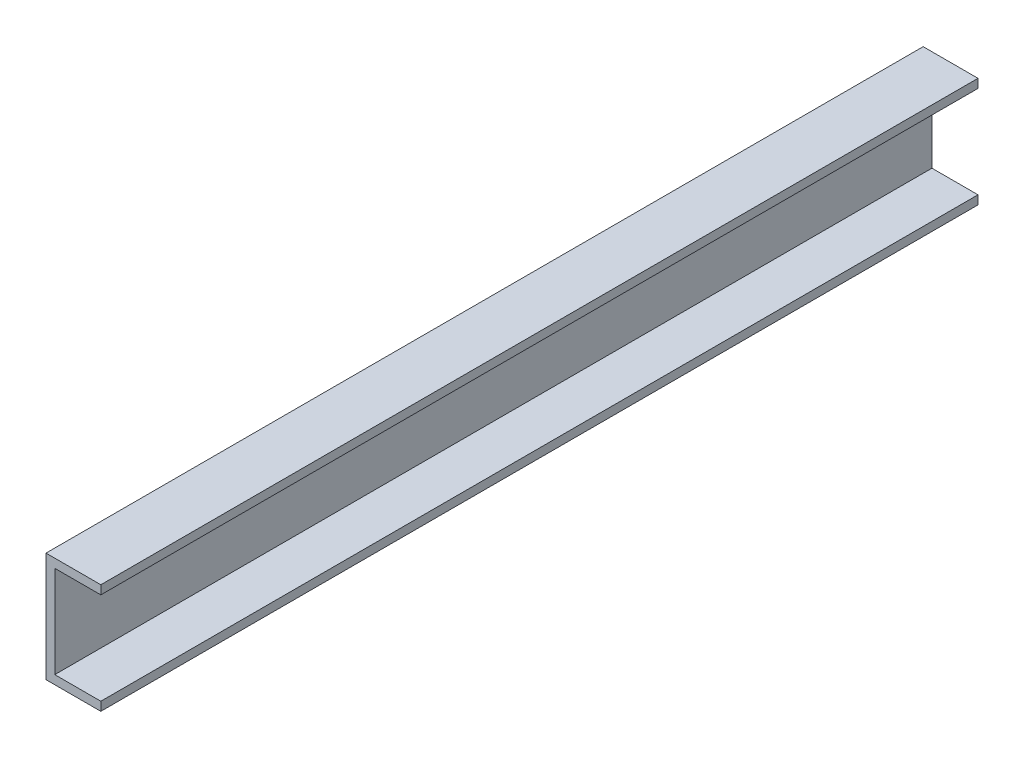
ISO-10303-21;
HEADER;
FILE_DESCRIPTION(('STEP AP214'),'2;1');
FILE_NAME('part.step','',(''),(''),'','','');
FILE_SCHEMA(('AUTOMOTIVE_DESIGN { 1 0 10303 214 1 1 1 1 }'));
ENDSEC;
DATA;
#1=APPLICATION_CONTEXT('core data for automotive mechanical design processes');
#2=APPLICATION_PROTOCOL_DEFINITION('international standard','automotive_design',2000,#1);
#3=PRODUCT_CONTEXT('',#1,'mechanical');
#4=PRODUCT('Part','Part','',(#3));
#5=PRODUCT_RELATED_PRODUCT_CATEGORY('part','',(#4));
#6=PRODUCT_DEFINITION_FORMATION('','',#4);
#7=PRODUCT_DEFINITION_CONTEXT('part definition',#1,'design');
#8=PRODUCT_DEFINITION('design','',#6,#7);
#9=PRODUCT_DEFINITION_SHAPE('','',#8);
#10=(LENGTH_UNIT() NAMED_UNIT(*) SI_UNIT(.MILLI.,.METRE.));
#11=(NAMED_UNIT(*) PLANE_ANGLE_UNIT() SI_UNIT($,.RADIAN.));
#12=(NAMED_UNIT(*) SI_UNIT($,.STERADIAN.) SOLID_ANGLE_UNIT());
#13=UNCERTAINTY_MEASURE_WITH_UNIT(LENGTH_MEASURE(1.E-05),#10,'distance_accuracy_value','');
#14=(GEOMETRIC_REPRESENTATION_CONTEXT(3) GLOBAL_UNCERTAINTY_ASSIGNED_CONTEXT((#13)) GLOBAL_UNIT_ASSIGNED_CONTEXT((#10,
#11,#12)) REPRESENTATION_CONTEXT('',''));
#15=CARTESIAN_POINT('',(0.,0.,0.));
#16=DIRECTION('',(0.,0.,1.));
#17=DIRECTION('',(1.,0.,0.));
#18=AXIS2_PLACEMENT_3D('',#15,#16,#17);
#19=CARTESIAN_POINT('',(50.,0.,800.));
#20=DIRECTION('',(0.,1.,0.));
#21=DIRECTION('',(-1.,0.,0.));
#22=AXIS2_PLACEMENT_3D('',#19,#20,#21);
#23=PLANE('',#22);
#24=DIRECTION('',(1.,0.,0.));
#25=VECTOR('',#24,1.);
#26=CARTESIAN_POINT('',(50.,0.,0.));
#27=LINE('',#26,#25);
#28=CARTESIAN_POINT('',(0.,0.,0.));
#29=VERTEX_POINT('',#28);
#30=CARTESIAN_POINT('',(50.,0.,0.));
#31=VERTEX_POINT('',#30);
#32=EDGE_CURVE('E135',#29,#31,#27,.T.);
#33=ORIENTED_EDGE('',*,*,#32,.T.);
#34=DIRECTION('',(0.,0.,-1.));
#35=VECTOR('',#34,1.);
#36=CARTESIAN_POINT('',(50.,0.,800.));
#37=LINE('',#36,#35);
#38=CARTESIAN_POINT('',(50.,0.,800.));
#39=VERTEX_POINT('',#38);
#40=EDGE_CURVE('E11',#39,#31,#37,.T.);
#41=ORIENTED_EDGE('',*,*,#40,.F.);
#42=DIRECTION('',(1.,0.,0.));
#43=VECTOR('',#42,1.);
#44=CARTESIAN_POINT('',(50.,0.,800.));
#45=LINE('',#44,#43);
#46=CARTESIAN_POINT('',(0.,0.,800.));
#47=VERTEX_POINT('',#46);
#48=EDGE_CURVE('E149',#47,#39,#45,.T.);
#49=ORIENTED_EDGE('',*,*,#48,.F.);
#50=DIRECTION('',(0.,0.,-1.));
#51=VECTOR('',#50,1.);
#52=CARTESIAN_POINT('',(0.,0.,800.));
#53=LINE('',#52,#51);
#54=EDGE_CURVE('E131',#47,#29,#53,.T.);
#55=ORIENTED_EDGE('',*,*,#54,.T.);
#56=EDGE_LOOP('',(#33,#41,#49,#55));
#57=FACE_BOUND('',#56,.T.);
#58=ADVANCED_FACE('F39',(#57),#23,.F.);
#59=CARTESIAN_POINT('',(50.,8.00000000000001,800.));
#60=DIRECTION('',(-1.,0.,0.));
#61=DIRECTION('',(0.,0.,1.));
#62=AXIS2_PLACEMENT_3D('',#59,#60,#61);
#63=PLANE('',#62);
#64=DIRECTION('',(0.,1.,0.));
#65=VECTOR('',#64,1.);
#66=CARTESIAN_POINT('',(50.,8.00000000000001,0.));
#67=LINE('',#66,#65);
#68=CARTESIAN_POINT('',(50.,8.00000000000001,0.));
#69=VERTEX_POINT('',#68);
#70=EDGE_CURVE('E138',#31,#69,#67,.T.);
#71=ORIENTED_EDGE('',*,*,#70,.T.);
#72=DIRECTION('',(0.,0.,-1.));
#73=VECTOR('',#72,1.);
#74=CARTESIAN_POINT('',(50.,8.00000000000001,800.));
#75=LINE('',#74,#73);
#76=CARTESIAN_POINT('',(50.,8.00000000000001,800.));
#77=VERTEX_POINT('',#76);
#78=EDGE_CURVE('E47',#77,#69,#75,.T.);
#79=ORIENTED_EDGE('',*,*,#78,.F.);
#80=DIRECTION('',(0.,1.,0.));
#81=VECTOR('',#80,1.);
#82=CARTESIAN_POINT('',(50.,8.00000000000001,800.));
#83=LINE('',#82,#81);
#84=EDGE_CURVE('E98',#39,#77,#83,.T.);
#85=ORIENTED_EDGE('',*,*,#84,.F.);
#86=ORIENTED_EDGE('',*,*,#40,.T.);
#87=EDGE_LOOP('',(#71,#79,#85,#86));
#88=FACE_BOUND('',#87,.T.);
#89=ADVANCED_FACE('F184',(#88),#63,.F.);
#90=CARTESIAN_POINT('',(8.00000000000001,8.00000000000001,800.));
#91=DIRECTION('',(0.,-1.,0.));
#92=DIRECTION('',(0.,0.,-1.));
#93=AXIS2_PLACEMENT_3D('',#90,#91,#92);
#94=PLANE('',#93);
#95=DIRECTION('',(-1.,0.,0.));
#96=VECTOR('',#95,1.);
#97=CARTESIAN_POINT('',(8.00000000000001,8.00000000000001,0.));
#98=LINE('',#97,#96);
#99=CARTESIAN_POINT('',(8.00000000000001,8.00000000000001,0.));
#100=VERTEX_POINT('',#99);
#101=EDGE_CURVE('E140',#69,#100,#98,.T.);
#102=ORIENTED_EDGE('',*,*,#101,.T.);
#103=DIRECTION('',(0.,0.,-1.));
#104=VECTOR('',#103,1.);
#105=CARTESIAN_POINT('',(8.00000000000001,8.00000000000001,800.));
#106=LINE('',#105,#104);
#107=CARTESIAN_POINT('',(8.00000000000001,8.00000000000001,800.));
#108=VERTEX_POINT('',#107);
#109=EDGE_CURVE('E156',#108,#100,#106,.T.);
#110=ORIENTED_EDGE('',*,*,#109,.F.);
#111=DIRECTION('',(-1.,0.,0.));
#112=VECTOR('',#111,1.);
#113=CARTESIAN_POINT('',(8.00000000000001,8.00000000000001,800.));
#114=LINE('',#113,#112);
#115=EDGE_CURVE('E164',#77,#108,#114,.T.);
#116=ORIENTED_EDGE('',*,*,#115,.F.);
#117=ORIENTED_EDGE('',*,*,#78,.T.);
#118=EDGE_LOOP('',(#102,#110,#116,#117));
#119=FACE_BOUND('',#118,.T.);
#120=ADVANCED_FACE('F162',(#119),#94,.F.);
#121=CARTESIAN_POINT('',(8.,92.,800.));
#122=DIRECTION('',(-1.,0.,0.));
#123=DIRECTION('',(0.,-1.,0.));
#124=AXIS2_PLACEMENT_3D('',#121,#122,#123);
#125=PLANE('',#124);
#126=DIRECTION('',(0.,1.,0.));
#127=VECTOR('',#126,1.);
#128=CARTESIAN_POINT('',(8.,92.,0.));
#129=LINE('',#128,#127);
#130=CARTESIAN_POINT('',(8.,92.,0.));
#131=VERTEX_POINT('',#130);
#132=EDGE_CURVE('E142',#100,#131,#129,.T.);
#133=ORIENTED_EDGE('',*,*,#132,.T.);
#134=DIRECTION('',(0.,0.,-1.));
#135=VECTOR('',#134,1.);
#136=CARTESIAN_POINT('',(8.,92.,800.));
#137=LINE('',#136,#135);
#138=CARTESIAN_POINT('',(8.,92.,800.));
#139=VERTEX_POINT('',#138);
#140=EDGE_CURVE('E153',#139,#131,#137,.T.);
#141=ORIENTED_EDGE('',*,*,#140,.F.);
#142=DIRECTION('',(0.,1.,0.));
#143=VECTOR('',#142,1.);
#144=CARTESIAN_POINT('',(8.,92.,800.));
#145=LINE('',#144,#143);
#146=EDGE_CURVE('E176',#108,#139,#145,.T.);
#147=ORIENTED_EDGE('',*,*,#146,.F.);
#148=ORIENTED_EDGE('',*,*,#109,.T.);
#149=EDGE_LOOP('',(#133,#141,#147,#148));
#150=FACE_BOUND('',#149,.T.);
#151=ADVANCED_FACE('F172',(#150),#125,.F.);
#152=CARTESIAN_POINT('',(50.,92.,800.));
#153=DIRECTION('',(0.,1.,0.));
#154=DIRECTION('',(0.,0.,1.));
#155=AXIS2_PLACEMENT_3D('',#152,#153,#154);
#156=PLANE('',#155);
#157=DIRECTION('',(1.,0.,0.));
#158=VECTOR('',#157,1.);
#159=CARTESIAN_POINT('',(50.,92.,0.));
#160=LINE('',#159,#158);
#161=CARTESIAN_POINT('',(50.,92.,0.));
#162=VERTEX_POINT('',#161);
#163=EDGE_CURVE('E144',#131,#162,#160,.T.);
#164=ORIENTED_EDGE('',*,*,#163,.T.);
#165=DIRECTION('',(0.,0.,-1.));
#166=VECTOR('',#165,1.);
#167=CARTESIAN_POINT('',(50.,92.,800.));
#168=LINE('',#167,#166);
#169=CARTESIAN_POINT('',(50.,92.,800.));
#170=VERTEX_POINT('',#169);
#171=EDGE_CURVE('E126',#170,#162,#168,.T.);
#172=ORIENTED_EDGE('',*,*,#171,.F.);
#173=DIRECTION('',(1.,0.,0.));
#174=VECTOR('',#173,1.);
#175=CARTESIAN_POINT('',(50.,92.,800.));
#176=LINE('',#175,#174);
#177=EDGE_CURVE('E117',#139,#170,#176,.T.);
#178=ORIENTED_EDGE('',*,*,#177,.F.);
#179=ORIENTED_EDGE('',*,*,#140,.T.);
#180=EDGE_LOOP('',(#164,#172,#178,#179));
#181=FACE_BOUND('',#180,.T.);
#182=ADVANCED_FACE('F175',(#181),#156,.F.);
#183=CARTESIAN_POINT('',(50.,100.,800.));
#184=DIRECTION('',(-1.,0.,0.));
#185=DIRECTION('',(0.,0.,1.));
#186=AXIS2_PLACEMENT_3D('',#183,#184,#185);
#187=PLANE('',#186);
#188=DIRECTION('',(0.,1.,0.));
#189=VECTOR('',#188,1.);
#190=CARTESIAN_POINT('',(50.,100.,0.));
#191=LINE('',#190,#189);
#192=CARTESIAN_POINT('',(50.,100.,0.));
#193=VERTEX_POINT('',#192);
#194=EDGE_CURVE('E125',#162,#193,#191,.T.);
#195=ORIENTED_EDGE('',*,*,#194,.T.);
#196=DIRECTION('',(0.,0.,-1.));
#197=VECTOR('',#196,1.);
#198=CARTESIAN_POINT('',(50.,100.,800.));
#199=LINE('',#198,#197);
#200=CARTESIAN_POINT('',(50.,100.,800.));
#201=VERTEX_POINT('',#200);
#202=EDGE_CURVE('E122',#201,#193,#199,.T.);
#203=ORIENTED_EDGE('',*,*,#202,.F.);
#204=DIRECTION('',(0.,1.,0.));
#205=VECTOR('',#204,1.);
#206=CARTESIAN_POINT('',(50.,100.,800.));
#207=LINE('',#206,#205);
#208=EDGE_CURVE('E111',#170,#201,#207,.T.);
#209=ORIENTED_EDGE('',*,*,#208,.F.);
#210=ORIENTED_EDGE('',*,*,#171,.T.);
#211=EDGE_LOOP('',(#195,#203,#209,#210));
#212=FACE_BOUND('',#211,.T.);
#213=ADVANCED_FACE('F123',(#212),#187,.F.);
#214=CARTESIAN_POINT('',(0.,100.,800.));
#215=DIRECTION('',(0.,-1.,0.));
#216=DIRECTION('',(0.,0.,-1.));
#217=AXIS2_PLACEMENT_3D('',#214,#215,#216);
#218=PLANE('',#217);
#219=DIRECTION('',(-1.,0.,0.));
#220=VECTOR('',#219,1.);
#221=CARTESIAN_POINT('',(0.,100.,0.));
#222=LINE('',#221,#220);
#223=CARTESIAN_POINT('',(0.,100.,0.));
#224=VERTEX_POINT('',#223);
#225=EDGE_CURVE('E84',#193,#224,#222,.T.);
#226=ORIENTED_EDGE('',*,*,#225,.T.);
#227=DIRECTION('',(0.,0.,-1.));
#228=VECTOR('',#227,1.);
#229=CARTESIAN_POINT('',(0.,100.,800.));
#230=LINE('',#229,#228);
#231=CARTESIAN_POINT('',(0.,100.,800.));
#232=VERTEX_POINT('',#231);
#233=EDGE_CURVE('E127',#232,#224,#230,.T.);
#234=ORIENTED_EDGE('',*,*,#233,.F.);
#235=DIRECTION('',(-1.,0.,0.));
#236=VECTOR('',#235,1.);
#237=CARTESIAN_POINT('',(0.,100.,800.));
#238=LINE('',#237,#236);
#239=EDGE_CURVE('E115',#201,#232,#238,.T.);
#240=ORIENTED_EDGE('',*,*,#239,.F.);
#241=ORIENTED_EDGE('',*,*,#202,.T.);
#242=EDGE_LOOP('',(#226,#234,#240,#241));
#243=FACE_BOUND('',#242,.T.);
#244=ADVANCED_FACE('F129',(#243),#218,.F.);
#245=CARTESIAN_POINT('',(0.,0.,800.));
#246=DIRECTION('',(1.,0.,0.));
#247=DIRECTION('',(0.,0.,-1.));
#248=AXIS2_PLACEMENT_3D('',#245,#246,#247);
#249=PLANE('',#248);
#250=DIRECTION('',(0.,-1.,0.));
#251=VECTOR('',#250,1.);
#252=CARTESIAN_POINT('',(0.,0.,0.));
#253=LINE('',#252,#251);
#254=EDGE_CURVE('E90',#224,#29,#253,.T.);
#255=ORIENTED_EDGE('',*,*,#254,.T.);
#256=ORIENTED_EDGE('',*,*,#54,.F.);
#257=DIRECTION('',(0.,-1.,0.));
#258=VECTOR('',#257,1.);
#259=CARTESIAN_POINT('',(0.,0.,800.));
#260=LINE('',#259,#258);
#261=EDGE_CURVE('E55',#232,#47,#260,.T.);
#262=ORIENTED_EDGE('',*,*,#261,.F.);
#263=ORIENTED_EDGE('',*,*,#233,.T.);
#264=EDGE_LOOP('',(#255,#256,#262,#263));
#265=FACE_BOUND('',#264,.T.);
#266=ADVANCED_FACE('F200',(#265),#249,.F.);
#267=CARTESIAN_POINT('',(0.,0.,800.));
#268=DIRECTION('',(0.,0.,-1.));
#269=DIRECTION('',(-1.,0.,0.));
#270=AXIS2_PLACEMENT_3D('',#267,#268,#269);
#271=PLANE('',#270);
#272=ORIENTED_EDGE('',*,*,#48,.T.);
#273=ORIENTED_EDGE('',*,*,#84,.T.);
#274=ORIENTED_EDGE('',*,*,#115,.T.);
#275=ORIENTED_EDGE('',*,*,#146,.T.);
#276=ORIENTED_EDGE('',*,*,#177,.T.);
#277=ORIENTED_EDGE('',*,*,#208,.T.);
#278=ORIENTED_EDGE('',*,*,#239,.T.);
#279=ORIENTED_EDGE('',*,*,#261,.T.);
#280=EDGE_LOOP('',(#272,#273,#274,#275,#276,#277,#278,#279));
#281=FACE_BOUND('',#280,.T.);
#282=ADVANCED_FACE('F113',(#281),#271,.F.);
#283=CARTESIAN_POINT('',(0.,0.,0.));
#284=DIRECTION('',(0.,0.,-1.));
#285=DIRECTION('',(-1.,0.,0.));
#286=AXIS2_PLACEMENT_3D('',#283,#284,#285);
#287=PLANE('',#286);
#288=ORIENTED_EDGE('',*,*,#32,.F.);
#289=ORIENTED_EDGE('',*,*,#254,.F.);
#290=ORIENTED_EDGE('',*,*,#225,.F.);
#291=ORIENTED_EDGE('',*,*,#194,.F.);
#292=ORIENTED_EDGE('',*,*,#163,.F.);
#293=ORIENTED_EDGE('',*,*,#132,.F.);
#294=ORIENTED_EDGE('',*,*,#101,.F.);
#295=ORIENTED_EDGE('',*,*,#70,.F.);
#296=EDGE_LOOP('',(#288,#289,#290,#291,#292,#293,#294,#295));
#297=FACE_BOUND('',#296,.T.);
#298=ADVANCED_FACE('F168',(#297),#287,.T.);
#299=CLOSED_SHELL('',(#58,#89,#120,#151,#182,#213,#244,#266,#282,#298));
#300=MANIFOLD_SOLID_BREP('B2',#299);
#301=ADVANCED_BREP_SHAPE_REPRESENTATION('',(#18,#300),#14);
#302=SHAPE_DEFINITION_REPRESENTATION(#9,#301);
ENDSEC;
END-ISO-10303-21;
